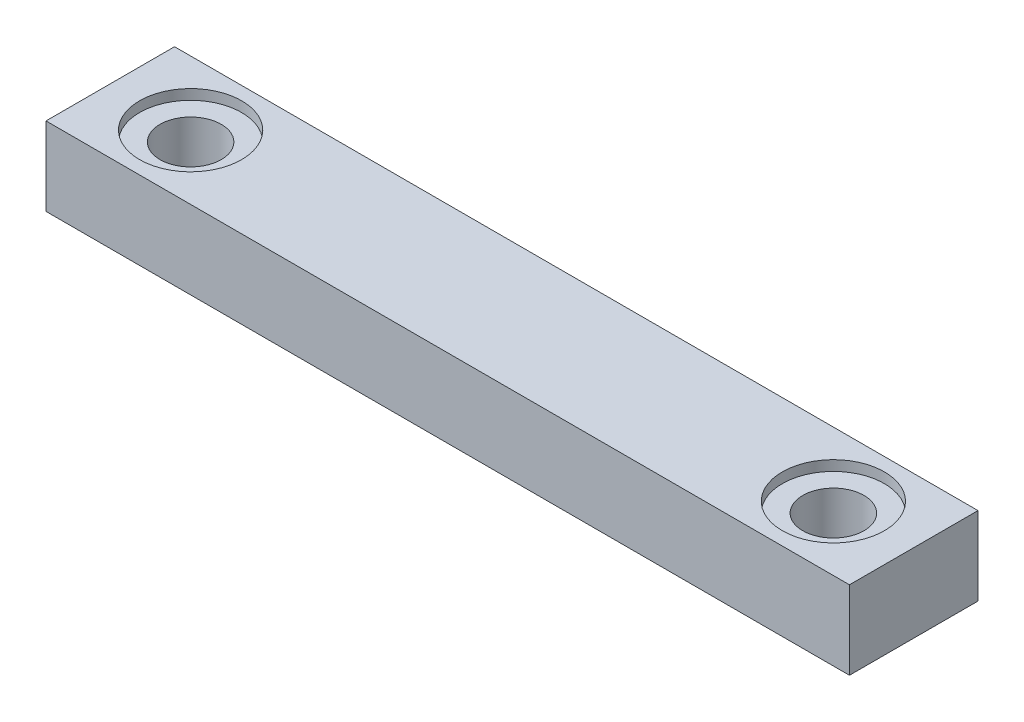
ISO-10303-21;
HEADER;
FILE_DESCRIPTION(('STEP AP214'),'2;1');
FILE_NAME('part.step','',(''),(''),'','','');
FILE_SCHEMA(('AUTOMOTIVE_DESIGN { 1 0 10303 214 1 1 1 1 }'));
ENDSEC;
DATA;
#1=APPLICATION_CONTEXT('core data for automotive mechanical design processes');
#2=APPLICATION_PROTOCOL_DEFINITION('international standard','automotive_design',2000,#1);
#3=PRODUCT_CONTEXT('',#1,'mechanical');
#4=PRODUCT('Part','Part','',(#3));
#5=PRODUCT_RELATED_PRODUCT_CATEGORY('part','',(#4));
#6=PRODUCT_DEFINITION_FORMATION('','',#4);
#7=PRODUCT_DEFINITION_CONTEXT('part definition',#1,'design');
#8=PRODUCT_DEFINITION('design','',#6,#7);
#9=PRODUCT_DEFINITION_SHAPE('','',#8);
#10=(LENGTH_UNIT() NAMED_UNIT(*) SI_UNIT(.MILLI.,.METRE.));
#11=(NAMED_UNIT(*) PLANE_ANGLE_UNIT() SI_UNIT($,.RADIAN.));
#12=(NAMED_UNIT(*) SI_UNIT($,.STERADIAN.) SOLID_ANGLE_UNIT());
#13=UNCERTAINTY_MEASURE_WITH_UNIT(LENGTH_MEASURE(1.E-05),#10,'distance_accuracy_value','');
#14=(GEOMETRIC_REPRESENTATION_CONTEXT(3) GLOBAL_UNCERTAINTY_ASSIGNED_CONTEXT((#13)) GLOBAL_UNIT_ASSIGNED_CONTEXT((#10,
#11,#12)) REPRESENTATION_CONTEXT('',''));
#15=CARTESIAN_POINT('',(0.,0.,0.));
#16=DIRECTION('',(0.,0.,1.));
#17=DIRECTION('',(1.,0.,0.));
#18=AXIS2_PLACEMENT_3D('',#15,#16,#17);
#19=CARTESIAN_POINT('',(-100.,24.392721671305,-1.66533453693773E-13));
#20=DIRECTION('',(0.,-1.,0.));
#21=DIRECTION('',(0.,0.,-1.));
#22=AXIS2_PLACEMENT_3D('',#19,#20,#21);
#23=CYLINDRICAL_SURFACE('',#22,9.52500000000001);
#24=CARTESIAN_POINT('',(-100.,0.,-1.66533453693773E-13));
#25=DIRECTION('',(0.,1.,0.));
#26=DIRECTION('',(0.,0.,1.));
#27=AXIS2_PLACEMENT_3D('',#24,#25,#26);
#28=CIRCLE('',#27,9.52500000000001);
#29=CARTESIAN_POINT('',(-100.,0.,9.52499999999984));
#30=VERTEX_POINT('',#29);
#31=EDGE_CURVE('E122',#30,#30,#28,.T.);
#32=ORIENTED_EDGE('',*,*,#31,.F.);
#33=EDGE_LOOP('',(#32));
#34=FACE_BOUND('',#33,.T.);
#35=CARTESIAN_POINT('',(-100.,21.217721671305,-1.66533453693773E-13));
#36=DIRECTION('',(0.,1.,0.));
#37=DIRECTION('',(0.,0.,1.));
#38=AXIS2_PLACEMENT_3D('',#35,#36,#37);
#39=CIRCLE('',#38,9.52500000000001);
#40=CARTESIAN_POINT('',(-100.,21.217721671305,9.52499999999984));
#41=VERTEX_POINT('',#40);
#42=EDGE_CURVE('E51',#41,#41,#39,.T.);
#43=ORIENTED_EDGE('',*,*,#42,.T.);
#44=EDGE_LOOP('',(#43));
#45=FACE_BOUND('',#44,.T.);
#46=ADVANCED_FACE('F50',(#34,#45),#23,.F.);
#47=CARTESIAN_POINT('',(100.,24.392721671305,-1.66533453693773E-13));
#48=DIRECTION('',(0.,-1.,0.));
#49=DIRECTION('',(0.,0.,-1.));
#50=AXIS2_PLACEMENT_3D('',#47,#48,#49);
#51=CYLINDRICAL_SURFACE('',#50,9.52500000000001);
#52=CARTESIAN_POINT('',(100.,0.,-1.66533453693773E-13));
#53=DIRECTION('',(0.,1.,0.));
#54=DIRECTION('',(0.,0.,1.));
#55=AXIS2_PLACEMENT_3D('',#52,#53,#54);
#56=CIRCLE('',#55,9.52500000000001);
#57=CARTESIAN_POINT('',(100.,0.,9.52499999999984));
#58=VERTEX_POINT('',#57);
#59=EDGE_CURVE('E117',#58,#58,#56,.T.);
#60=ORIENTED_EDGE('',*,*,#59,.F.);
#61=EDGE_LOOP('',(#60));
#62=FACE_BOUND('',#61,.T.);
#63=CARTESIAN_POINT('',(100.,21.217721671305,-1.66533453693773E-13));
#64=DIRECTION('',(0.,1.,0.));
#65=DIRECTION('',(0.,0.,1.));
#66=AXIS2_PLACEMENT_3D('',#63,#64,#65);
#67=CIRCLE('',#66,9.52500000000001);
#68=CARTESIAN_POINT('',(100.,21.217721671305,9.52499999999984));
#69=VERTEX_POINT('',#68);
#70=EDGE_CURVE('E140',#69,#69,#67,.T.);
#71=ORIENTED_EDGE('',*,*,#70,.T.);
#72=EDGE_LOOP('',(#71));
#73=FACE_BOUND('',#72,.T.);
#74=ADVANCED_FACE('F47',(#62,#73),#51,.F.);
#75=CARTESIAN_POINT('',(0.,24.392721671305,19.9999999999999));
#76=DIRECTION('',(0.,0.,-1.));
#77=DIRECTION('',(-1.,0.,0.));
#78=AXIS2_PLACEMENT_3D('',#75,#76,#77);
#79=PLANE('',#78);
#80=DIRECTION('',(1.,0.,0.));
#81=VECTOR('',#80,1.);
#82=CARTESIAN_POINT('',(0.,0.,19.9999999999999));
#83=LINE('',#82,#81);
#84=CARTESIAN_POINT('',(-124.999999999999,0.,19.9999999999999));
#85=VERTEX_POINT('',#84);
#86=CARTESIAN_POINT('',(125.000000000001,0.,19.9999999999999));
#87=VERTEX_POINT('',#86);
#88=EDGE_CURVE('E127',#85,#87,#83,.T.);
#89=ORIENTED_EDGE('',*,*,#88,.T.);
#90=DIRECTION('',(0.,-1.,0.));
#91=VECTOR('',#90,1.);
#92=CARTESIAN_POINT('',(125.000000000001,24.392721671305,19.9999999999999));
#93=LINE('',#92,#91);
#94=CARTESIAN_POINT('',(125.000000000001,24.392721671305,19.9999999999999));
#95=VERTEX_POINT('',#94);
#96=EDGE_CURVE('E11',#95,#87,#93,.T.);
#97=ORIENTED_EDGE('',*,*,#96,.F.);
#98=DIRECTION('',(1.,0.,0.));
#99=VECTOR('',#98,1.);
#100=CARTESIAN_POINT('',(0.,24.392721671305,19.9999999999999));
#101=LINE('',#100,#99);
#102=CARTESIAN_POINT('',(-124.999999999999,24.392721671305,19.9999999999999));
#103=VERTEX_POINT('',#102);
#104=EDGE_CURVE('E89',#103,#95,#101,.T.);
#105=ORIENTED_EDGE('',*,*,#104,.F.);
#106=DIRECTION('',(0.,-1.,0.));
#107=VECTOR('',#106,1.);
#108=CARTESIAN_POINT('',(-124.999999999999,24.392721671305,19.9999999999999));
#109=LINE('',#108,#107);
#110=EDGE_CURVE('E111',#103,#85,#109,.T.);
#111=ORIENTED_EDGE('',*,*,#110,.T.);
#112=EDGE_LOOP('',(#89,#97,#105,#111));
#113=FACE_BOUND('',#112,.T.);
#114=ADVANCED_FACE('F195',(#113),#79,.F.);
#115=CARTESIAN_POINT('',(125.000000000001,24.392721671305,0.));
#116=DIRECTION('',(1.,0.,0.));
#117=DIRECTION('',(0.,0.,-1.));
#118=AXIS2_PLACEMENT_3D('',#115,#116,#117);
#119=PLANE('',#118);
#120=DIRECTION('',(0.,0.,1.));
#121=VECTOR('',#120,1.);
#122=CARTESIAN_POINT('',(125.000000000001,0.,0.));
#123=LINE('',#122,#121);
#124=CARTESIAN_POINT('',(125.000000000001,0.,-20.0000000000001));
#125=VERTEX_POINT('',#124);
#126=EDGE_CURVE('E97',#125,#87,#123,.T.);
#127=ORIENTED_EDGE('',*,*,#126,.F.);
#128=DIRECTION('',(0.,-1.,0.));
#129=VECTOR('',#128,1.);
#130=CARTESIAN_POINT('',(125.000000000001,24.392721671305,-20.0000000000001));
#131=LINE('',#130,#129);
#132=CARTESIAN_POINT('',(125.000000000001,24.392721671305,-20.0000000000001));
#133=VERTEX_POINT('',#132);
#134=EDGE_CURVE('E59',#133,#125,#131,.T.);
#135=ORIENTED_EDGE('',*,*,#134,.F.);
#136=DIRECTION('',(0.,0.,1.));
#137=VECTOR('',#136,1.);
#138=CARTESIAN_POINT('',(125.000000000001,24.392721671305,0.));
#139=LINE('',#138,#137);
#140=EDGE_CURVE('E100',#133,#95,#139,.T.);
#141=ORIENTED_EDGE('',*,*,#140,.T.);
#142=ORIENTED_EDGE('',*,*,#96,.T.);
#143=EDGE_LOOP('',(#127,#135,#141,#142));
#144=FACE_BOUND('',#143,.T.);
#145=ADVANCED_FACE('F96',(#144),#119,.T.);
#146=CARTESIAN_POINT('',(0.,24.392721671305,-20.0000000000001));
#147=DIRECTION('',(0.,0.,-1.));
#148=DIRECTION('',(-1.,0.,0.));
#149=AXIS2_PLACEMENT_3D('',#146,#147,#148);
#150=PLANE('',#149);
#151=DIRECTION('',(1.,0.,0.));
#152=VECTOR('',#151,1.);
#153=CARTESIAN_POINT('',(0.,0.,-20.0000000000001));
#154=LINE('',#153,#152);
#155=CARTESIAN_POINT('',(-124.999999999999,0.,-20.0000000000001));
#156=VERTEX_POINT('',#155);
#157=EDGE_CURVE('E135',#156,#125,#154,.T.);
#158=ORIENTED_EDGE('',*,*,#157,.F.);
#159=DIRECTION('',(0.,-1.,0.));
#160=VECTOR('',#159,1.);
#161=CARTESIAN_POINT('',(-124.999999999999,24.392721671305,-20.0000000000001));
#162=LINE('',#161,#160);
#163=CARTESIAN_POINT('',(-124.999999999999,24.392721671305,-20.0000000000001));
#164=VERTEX_POINT('',#163);
#165=EDGE_CURVE('E82',#164,#156,#162,.T.);
#166=ORIENTED_EDGE('',*,*,#165,.F.);
#167=DIRECTION('',(1.,0.,0.));
#168=VECTOR('',#167,1.);
#169=CARTESIAN_POINT('',(0.,24.392721671305,-20.0000000000001));
#170=LINE('',#169,#168);
#171=EDGE_CURVE('E110',#164,#133,#170,.T.);
#172=ORIENTED_EDGE('',*,*,#171,.T.);
#173=ORIENTED_EDGE('',*,*,#134,.T.);
#174=EDGE_LOOP('',(#158,#166,#172,#173));
#175=FACE_BOUND('',#174,.T.);
#176=ADVANCED_FACE('F109',(#175),#150,.T.);
#177=CARTESIAN_POINT('',(-124.999999999999,24.392721671305,0.));
#178=DIRECTION('',(1.,0.,0.));
#179=DIRECTION('',(0.,0.,-1.));
#180=AXIS2_PLACEMENT_3D('',#177,#178,#179);
#181=PLANE('',#180);
#182=DIRECTION('',(0.,0.,1.));
#183=VECTOR('',#182,1.);
#184=CARTESIAN_POINT('',(-124.999999999999,0.,0.));
#185=LINE('',#184,#183);
#186=EDGE_CURVE('E85',#156,#85,#185,.T.);
#187=ORIENTED_EDGE('',*,*,#186,.T.);
#188=ORIENTED_EDGE('',*,*,#110,.F.);
#189=DIRECTION('',(0.,0.,1.));
#190=VECTOR('',#189,1.);
#191=CARTESIAN_POINT('',(-124.999999999999,24.392721671305,0.));
#192=LINE('',#191,#190);
#193=EDGE_CURVE('E67',#164,#103,#192,.T.);
#194=ORIENTED_EDGE('',*,*,#193,.F.);
#195=ORIENTED_EDGE('',*,*,#165,.T.);
#196=EDGE_LOOP('',(#187,#188,#194,#195));
#197=FACE_BOUND('',#196,.T.);
#198=ADVANCED_FACE('F179',(#197),#181,.F.);
#199=CARTESIAN_POINT('',(0.,24.392721671305,0.));
#200=DIRECTION('',(0.,1.,0.));
#201=DIRECTION('',(0.,0.,1.));
#202=AXIS2_PLACEMENT_3D('',#199,#200,#201);
#203=PLANE('',#202);
#204=CARTESIAN_POINT('',(-100.,24.392721671305,-1.66533453693773E-13));
#205=DIRECTION('',(0.,1.,0.));
#206=DIRECTION('',(0.,0.,1.));
#207=AXIS2_PLACEMENT_3D('',#204,#205,#206);
#208=CIRCLE('',#207,15.8749999999999);
#209=CARTESIAN_POINT('',(-100.,24.392721671305,15.8749999999998));
#210=VERTEX_POINT('',#209);
#211=EDGE_CURVE('E147',#210,#210,#208,.T.);
#212=ORIENTED_EDGE('',*,*,#211,.F.);
#213=EDGE_LOOP('',(#212));
#214=FACE_BOUND('',#213,.T.);
#215=CARTESIAN_POINT('',(100.,24.392721671305,-1.66533453693773E-13));
#216=DIRECTION('',(0.,1.,0.));
#217=DIRECTION('',(0.,0.,1.));
#218=AXIS2_PLACEMENT_3D('',#215,#216,#217);
#219=CIRCLE('',#218,15.8749999999999);
#220=CARTESIAN_POINT('',(100.,24.392721671305,15.8749999999998));
#221=VERTEX_POINT('',#220);
#222=EDGE_CURVE('E156',#221,#221,#219,.T.);
#223=ORIENTED_EDGE('',*,*,#222,.F.);
#224=EDGE_LOOP('',(#223));
#225=FACE_BOUND('',#224,.T.);
#226=ORIENTED_EDGE('',*,*,#104,.T.);
#227=ORIENTED_EDGE('',*,*,#140,.F.);
#228=ORIENTED_EDGE('',*,*,#171,.F.);
#229=ORIENTED_EDGE('',*,*,#193,.T.);
#230=EDGE_LOOP('',(#226,#227,#228,#229));
#231=FACE_BOUND('',#230,.T.);
#232=ADVANCED_FACE('F106',(#214,#225,#231),#203,.T.);
#233=CARTESIAN_POINT('',(0.,0.,0.));
#234=DIRECTION('',(0.,1.,0.));
#235=DIRECTION('',(0.,0.,1.));
#236=AXIS2_PLACEMENT_3D('',#233,#234,#235);
#237=PLANE('',#236);
#238=ORIENTED_EDGE('',*,*,#59,.T.);
#239=EDGE_LOOP('',(#238));
#240=FACE_BOUND('',#239,.T.);
#241=ORIENTED_EDGE('',*,*,#31,.T.);
#242=EDGE_LOOP('',(#241));
#243=FACE_BOUND('',#242,.T.);
#244=ORIENTED_EDGE('',*,*,#88,.F.);
#245=ORIENTED_EDGE('',*,*,#186,.F.);
#246=ORIENTED_EDGE('',*,*,#157,.T.);
#247=ORIENTED_EDGE('',*,*,#126,.T.);
#248=EDGE_LOOP('',(#244,#245,#246,#247));
#249=FACE_BOUND('',#248,.T.);
#250=ADVANCED_FACE('F172',(#240,#243,#249),#237,.F.);
#251=CARTESIAN_POINT('',(100.,21.217721671305,-1.66533453693773E-13));
#252=DIRECTION('',(0.,1.,0.));
#253=DIRECTION('',(0.,0.,1.));
#254=AXIS2_PLACEMENT_3D('',#251,#252,#253);
#255=CYLINDRICAL_SURFACE('',#254,15.8749999999999);
#256=CARTESIAN_POINT('',(100.,21.217721671305,-1.66533453693773E-13));
#257=DIRECTION('',(0.,1.,0.));
#258=DIRECTION('',(0.,0.,1.));
#259=AXIS2_PLACEMENT_3D('',#256,#257,#258);
#260=CIRCLE('',#259,15.8749999999999);
#261=CARTESIAN_POINT('',(100.,21.217721671305,15.8749999999998));
#262=VERTEX_POINT('',#261);
#263=EDGE_CURVE('E165',#262,#262,#260,.T.);
#264=ORIENTED_EDGE('',*,*,#263,.F.);
#265=EDGE_LOOP('',(#264));
#266=FACE_BOUND('',#265,.T.);
#267=ORIENTED_EDGE('',*,*,#222,.T.);
#268=EDGE_LOOP('',(#267));
#269=FACE_BOUND('',#268,.T.);
#270=ADVANCED_FACE('F168',(#266,#269),#255,.F.);
#271=CARTESIAN_POINT('',(100.,21.217721671305,-1.66533453693773E-13));
#272=DIRECTION('',(0.,1.,0.));
#273=DIRECTION('',(0.,0.,1.));
#274=AXIS2_PLACEMENT_3D('',#271,#272,#273);
#275=PLANE('',#274);
#276=ORIENTED_EDGE('',*,*,#70,.F.);
#277=EDGE_LOOP('',(#276));
#278=FACE_BOUND('',#277,.T.);
#279=ORIENTED_EDGE('',*,*,#263,.T.);
#280=EDGE_LOOP('',(#279));
#281=FACE_BOUND('',#280,.T.);
#282=ADVANCED_FACE('F169',(#278,#281),#275,.T.);
#283=CARTESIAN_POINT('',(-100.,21.217721671305,-1.66533453693773E-13));
#284=DIRECTION('',(0.,1.,0.));
#285=DIRECTION('',(0.,0.,1.));
#286=AXIS2_PLACEMENT_3D('',#283,#284,#285);
#287=CYLINDRICAL_SURFACE('',#286,15.8749999999999);
#288=CARTESIAN_POINT('',(-100.,21.217721671305,-1.66533453693773E-13));
#289=DIRECTION('',(0.,1.,0.));
#290=DIRECTION('',(0.,0.,1.));
#291=AXIS2_PLACEMENT_3D('',#288,#289,#290);
#292=CIRCLE('',#291,15.8749999999999);
#293=CARTESIAN_POINT('',(-100.,21.217721671305,15.8749999999998));
#294=VERTEX_POINT('',#293);
#295=EDGE_CURVE('E141',#294,#294,#292,.T.);
#296=ORIENTED_EDGE('',*,*,#295,.F.);
#297=EDGE_LOOP('',(#296));
#298=FACE_BOUND('',#297,.T.);
#299=ORIENTED_EDGE('',*,*,#211,.T.);
#300=EDGE_LOOP('',(#299));
#301=FACE_BOUND('',#300,.T.);
#302=ADVANCED_FACE('F248',(#298,#301),#287,.F.);
#303=CARTESIAN_POINT('',(-100.,21.217721671305,-1.66533453693773E-13));
#304=DIRECTION('',(0.,1.,0.));
#305=DIRECTION('',(0.,0.,1.));
#306=AXIS2_PLACEMENT_3D('',#303,#304,#305);
#307=PLANE('',#306);
#308=ORIENTED_EDGE('',*,*,#42,.F.);
#309=EDGE_LOOP('',(#308));
#310=FACE_BOUND('',#309,.T.);
#311=ORIENTED_EDGE('',*,*,#295,.T.);
#312=EDGE_LOOP('',(#311));
#313=FACE_BOUND('',#312,.T.);
#314=ADVANCED_FACE('F256',(#310,#313),#307,.T.);
#315=CLOSED_SHELL('',(#46,#74,#114,#145,#176,#198,#232,#250,#270,#282,#302,#314));
#316=MANIFOLD_SOLID_BREP('B2',#315);
#317=ADVANCED_BREP_SHAPE_REPRESENTATION('',(#18,#316),#14);
#318=SHAPE_DEFINITION_REPRESENTATION(#9,#317);
ENDSEC;
END-ISO-10303-21;
